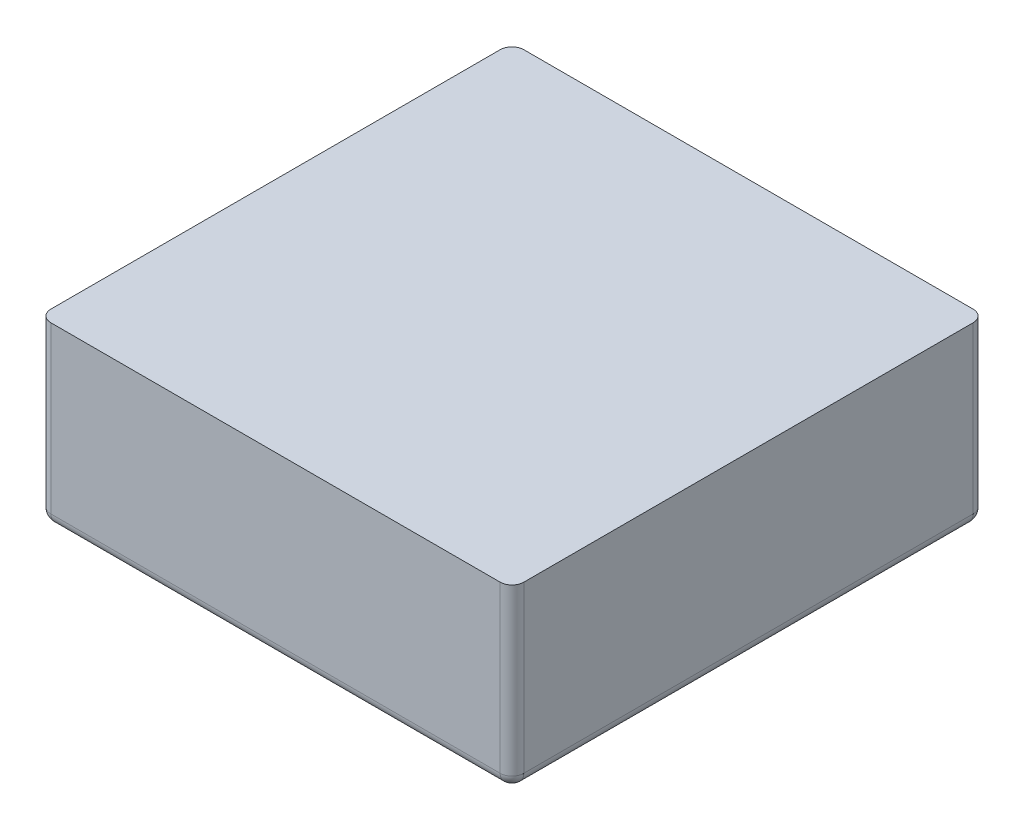
ISO-10303-21;
HEADER;
FILE_DESCRIPTION(('STEP AP214'),'2;1');
FILE_NAME('part.step','',(''),(''),'','','');
FILE_SCHEMA(('AUTOMOTIVE_DESIGN { 1 0 10303 214 1 1 1 1 }'));
ENDSEC;
DATA;
#1=APPLICATION_CONTEXT('core data for automotive mechanical design processes');
#2=APPLICATION_PROTOCOL_DEFINITION('international standard','automotive_design',2000,#1);
#3=PRODUCT_CONTEXT('',#1,'mechanical');
#4=PRODUCT('Part','Part','',(#3));
#5=PRODUCT_RELATED_PRODUCT_CATEGORY('part','',(#4));
#6=PRODUCT_DEFINITION_FORMATION('','',#4);
#7=PRODUCT_DEFINITION_CONTEXT('part definition',#1,'design');
#8=PRODUCT_DEFINITION('design','',#6,#7);
#9=PRODUCT_DEFINITION_SHAPE('','',#8);
#10=(LENGTH_UNIT() NAMED_UNIT(*) SI_UNIT(.MILLI.,.METRE.));
#11=(NAMED_UNIT(*) PLANE_ANGLE_UNIT() SI_UNIT($,.RADIAN.));
#12=(NAMED_UNIT(*) SI_UNIT($,.STERADIAN.) SOLID_ANGLE_UNIT());
#13=UNCERTAINTY_MEASURE_WITH_UNIT(LENGTH_MEASURE(1.E-05),#10,'distance_accuracy_value','');
#14=(GEOMETRIC_REPRESENTATION_CONTEXT(3) GLOBAL_UNCERTAINTY_ASSIGNED_CONTEXT((#13)) GLOBAL_UNIT_ASSIGNED_CONTEXT((#10,
#11,#12)) REPRESENTATION_CONTEXT('',''));
#15=CARTESIAN_POINT('',(0.,0.,0.));
#16=DIRECTION('',(0.,0.,1.));
#17=DIRECTION('',(1.,0.,0.));
#18=AXIS2_PLACEMENT_3D('',#15,#16,#17);
#19=CARTESIAN_POINT('',(-0.4,-0.8,-0.4));
#20=DIRECTION('',(0.,-1.,0.));
#21=DIRECTION('',(0.,0.,-1.));
#22=AXIS2_PLACEMENT_3D('',#19,#20,#21);
#23=PLANE('',#22);
#24=DIRECTION('',(0.,0.,1.));
#25=VECTOR('',#24,1.);
#26=CARTESIAN_POINT('',(0.38,-0.8,-0.4));
#27=LINE('',#26,#25);
#28=CARTESIAN_POINT('',(0.38,-0.8,0.38));
#29=VERTEX_POINT('',#28);
#30=CARTESIAN_POINT('',(0.38,-0.8,-0.38));
#31=VERTEX_POINT('',#30);
#32=EDGE_CURVE('E105',#29,#31,#27,.F.);
#33=ORIENTED_EDGE('',*,*,#32,.F.);
#34=DIRECTION('',(-1.,0.,0.));
#35=VECTOR('',#34,1.);
#36=CARTESIAN_POINT('',(-0.4,-0.8,0.38));
#37=LINE('',#36,#35);
#38=CARTESIAN_POINT('',(-0.38,-0.8,0.380000000000024));
#39=VERTEX_POINT('',#38);
#40=EDGE_CURVE('E100',#39,#29,#37,.F.);
#41=ORIENTED_EDGE('',*,*,#40,.F.);
#42=DIRECTION('',(0.,0.,-1.));
#43=VECTOR('',#42,1.);
#44=CARTESIAN_POINT('',(-0.38,-0.8,-0.4));
#45=LINE('',#44,#43);
#46=CARTESIAN_POINT('',(-0.38,-0.8,-0.38));
#47=VERTEX_POINT('',#46);
#48=EDGE_CURVE('E103',#47,#39,#45,.F.);
#49=ORIENTED_EDGE('',*,*,#48,.F.);
#50=DIRECTION('',(1.,0.,0.));
#51=VECTOR('',#50,1.);
#52=CARTESIAN_POINT('',(-0.4,-0.8,-0.38));
#53=LINE('',#52,#51);
#54=EDGE_CURVE('E167',#31,#47,#53,.F.);
#55=ORIENTED_EDGE('',*,*,#54,.F.);
#56=EDGE_LOOP('',(#33,#41,#49,#55));
#57=FACE_BOUND('',#56,.T.);
#58=ADVANCED_FACE('F16',(#57),#23,.T.);
#59=CARTESIAN_POINT('',(0.38,-0.78,0.38));
#60=DIRECTION('',(1.,0.,0.));
#61=DIRECTION('',(0.,1.,0.));
#62=AXIS2_PLACEMENT_3D('',#59,#60,#61);
#63=SPHERICAL_SURFACE('',#62,0.02);
#64=CARTESIAN_POINT('',(0.38,-0.78,0.38));
#65=DIRECTION('',(-1.,0.,0.));
#66=DIRECTION('',(0.,0.,1.));
#67=AXIS2_PLACEMENT_3D('',#64,#65,#66);
#68=CIRCLE('',#67,0.02);
#69=CARTESIAN_POINT('',(0.38,-0.78,0.4));
#70=VERTEX_POINT('',#69);
#71=EDGE_CURVE('E108',#29,#70,#68,.T.);
#72=ORIENTED_EDGE('',*,*,#71,.F.);
#73=CARTESIAN_POINT('',(0.38,-0.78,0.38));
#74=DIRECTION('',(0.,0.,1.));
#75=DIRECTION('',(1.,0.,0.));
#76=AXIS2_PLACEMENT_3D('',#73,#74,#75);
#77=CIRCLE('',#76,0.02);
#78=CARTESIAN_POINT('',(0.4,-0.78,0.38));
#79=VERTEX_POINT('',#78);
#80=EDGE_CURVE('E164',#79,#29,#77,.F.);
#81=ORIENTED_EDGE('',*,*,#80,.F.);
#82=CARTESIAN_POINT('',(0.38,-0.78,0.38));
#83=DIRECTION('',(0.,-1.,0.));
#84=DIRECTION('',(0.,0.,-1.));
#85=AXIS2_PLACEMENT_3D('',#82,#83,#84);
#86=CIRCLE('',#85,0.02);
#87=EDGE_CURVE('E230',#70,#79,#86,.F.);
#88=ORIENTED_EDGE('',*,*,#87,.F.);
#89=EDGE_LOOP('',(#72,#81,#88));
#90=FACE_BOUND('',#89,.T.);
#91=ADVANCED_FACE('F154',(#90),#63,.T.);
#92=CARTESIAN_POINT('',(-0.4,-0.78,0.38));
#93=DIRECTION('',(-1.,0.,0.));
#94=DIRECTION('',(0.,0.,1.));
#95=AXIS2_PLACEMENT_3D('',#92,#93,#94);
#96=CYLINDRICAL_SURFACE('',#95,0.02);
#97=ORIENTED_EDGE('',*,*,#71,.T.);
#98=DIRECTION('',(-1.,0.,0.));
#99=VECTOR('',#98,1.);
#100=CARTESIAN_POINT('',(0.4,-0.78,0.4));
#101=LINE('',#100,#99);
#102=CARTESIAN_POINT('',(-0.38,-0.78,0.4));
#103=VERTEX_POINT('',#102);
#104=EDGE_CURVE('E114',#70,#103,#101,.T.);
#105=ORIENTED_EDGE('',*,*,#104,.T.);
#106=CARTESIAN_POINT('',(-0.38,-0.78,0.38));
#107=DIRECTION('',(1.,0.,0.));
#108=DIRECTION('',(0.,1.,0.));
#109=AXIS2_PLACEMENT_3D('',#106,#107,#108);
#110=CIRCLE('',#109,0.0200000000000001);
#111=EDGE_CURVE('E111',#39,#103,#110,.F.);
#112=ORIENTED_EDGE('',*,*,#111,.F.);
#113=ORIENTED_EDGE('',*,*,#40,.T.);
#114=EDGE_LOOP('',(#97,#105,#112,#113));
#115=FACE_BOUND('',#114,.T.);
#116=ADVANCED_FACE('F112',(#115),#96,.T.);
#117=CARTESIAN_POINT('',(-0.38,-0.78,0.38));
#118=DIRECTION('',(1.,0.,0.));
#119=DIRECTION('',(0.,1.,0.));
#120=AXIS2_PLACEMENT_3D('',#117,#118,#119);
#121=SPHERICAL_SURFACE('',#120,0.02);
#122=CARTESIAN_POINT('',(-0.38,-0.78,0.38));
#123=DIRECTION('',(0.,-1.,0.));
#124=DIRECTION('',(0.,0.,-1.));
#125=AXIS2_PLACEMENT_3D('',#122,#123,#124);
#126=CIRCLE('',#125,0.02);
#127=CARTESIAN_POINT('',(-0.4,-0.78,0.38));
#128=VERTEX_POINT('',#127);
#129=EDGE_CURVE('E129',#128,#103,#126,.F.);
#130=ORIENTED_EDGE('',*,*,#129,.F.);
#131=CARTESIAN_POINT('',(-0.38,-0.78,0.38));
#132=DIRECTION('',(0.,0.,-1.));
#133=DIRECTION('',(-1.,0.,0.));
#134=AXIS2_PLACEMENT_3D('',#131,#132,#133);
#135=CIRCLE('',#134,0.02);
#136=EDGE_CURVE('E120',#39,#128,#135,.T.);
#137=ORIENTED_EDGE('',*,*,#136,.F.);
#138=ORIENTED_EDGE('',*,*,#111,.T.);
#139=EDGE_LOOP('',(#130,#137,#138));
#140=FACE_BOUND('',#139,.T.);
#141=ADVANCED_FACE('F128',(#140),#121,.T.);
#142=CARTESIAN_POINT('',(-0.38,-0.78,-0.4));
#143=DIRECTION('',(0.,0.,-1.));
#144=DIRECTION('',(-1.,0.,0.));
#145=AXIS2_PLACEMENT_3D('',#142,#143,#144);
#146=CYLINDRICAL_SURFACE('',#145,0.02);
#147=CARTESIAN_POINT('',(-0.38,-0.78,-0.38));
#148=DIRECTION('',(0.,0.,-1.));
#149=DIRECTION('',(1.,0.,0.));
#150=AXIS2_PLACEMENT_3D('',#147,#148,#149);
#151=CIRCLE('',#150,0.02);
#152=CARTESIAN_POINT('',(-0.4,-0.78,-0.38));
#153=VERTEX_POINT('',#152);
#154=EDGE_CURVE('E125',#47,#153,#151,.T.);
#155=ORIENTED_EDGE('',*,*,#154,.F.);
#156=ORIENTED_EDGE('',*,*,#48,.T.);
#157=ORIENTED_EDGE('',*,*,#136,.T.);
#158=DIRECTION('',(0.,0.,-1.));
#159=VECTOR('',#158,1.);
#160=CARTESIAN_POINT('',(-0.4,-0.78,0.4));
#161=LINE('',#160,#159);
#162=EDGE_CURVE('E222',#128,#153,#161,.T.);
#163=ORIENTED_EDGE('',*,*,#162,.T.);
#164=EDGE_LOOP('',(#155,#156,#157,#163));
#165=FACE_BOUND('',#164,.T.);
#166=ADVANCED_FACE('F123',(#165),#146,.T.);
#167=CARTESIAN_POINT('',(-0.38,-0.78,-0.38));
#168=DIRECTION('',(1.,0.,0.));
#169=DIRECTION('',(0.,1.,0.));
#170=AXIS2_PLACEMENT_3D('',#167,#168,#169);
#171=SPHERICAL_SURFACE('',#170,0.02);
#172=CARTESIAN_POINT('',(-0.38,-0.78,-0.38));
#173=DIRECTION('',(0.,-1.,0.));
#174=DIRECTION('',(0.,0.,-1.));
#175=AXIS2_PLACEMENT_3D('',#172,#173,#174);
#176=CIRCLE('',#175,0.02);
#177=CARTESIAN_POINT('',(-0.38,-0.78,-0.4));
#178=VERTEX_POINT('',#177);
#179=EDGE_CURVE('E217',#178,#153,#176,.F.);
#180=ORIENTED_EDGE('',*,*,#179,.F.);
#181=CARTESIAN_POINT('',(-0.38,-0.78,-0.38));
#182=DIRECTION('',(1.,0.,0.));
#183=DIRECTION('',(0.,0.,-1.));
#184=AXIS2_PLACEMENT_3D('',#181,#182,#183);
#185=CIRCLE('',#184,0.02);
#186=EDGE_CURVE('E170',#47,#178,#185,.T.);
#187=ORIENTED_EDGE('',*,*,#186,.F.);
#188=ORIENTED_EDGE('',*,*,#154,.T.);
#189=EDGE_LOOP('',(#180,#187,#188));
#190=FACE_BOUND('',#189,.T.);
#191=ADVANCED_FACE('F266',(#190),#171,.T.);
#192=CARTESIAN_POINT('',(-0.4,-0.78,-0.38));
#193=DIRECTION('',(1.,0.,0.));
#194=DIRECTION('',(0.,0.,-1.));
#195=AXIS2_PLACEMENT_3D('',#192,#193,#194);
#196=CYLINDRICAL_SURFACE('',#195,0.02);
#197=CARTESIAN_POINT('',(0.38,-0.78,-0.38));
#198=DIRECTION('',(1.,0.,0.));
#199=DIRECTION('',(0.,1.,0.));
#200=AXIS2_PLACEMENT_3D('',#197,#198,#199);
#201=CIRCLE('',#200,0.0200000000000001);
#202=CARTESIAN_POINT('',(0.38,-0.78,-0.4));
#203=VERTEX_POINT('',#202);
#204=EDGE_CURVE('E169',#31,#203,#201,.T.);
#205=ORIENTED_EDGE('',*,*,#204,.F.);
#206=ORIENTED_EDGE('',*,*,#54,.T.);
#207=ORIENTED_EDGE('',*,*,#186,.T.);
#208=DIRECTION('',(1.,0.,0.));
#209=VECTOR('',#208,1.);
#210=CARTESIAN_POINT('',(-0.4,-0.78,-0.4));
#211=LINE('',#210,#209);
#212=EDGE_CURVE('E212',#178,#203,#211,.T.);
#213=ORIENTED_EDGE('',*,*,#212,.T.);
#214=EDGE_LOOP('',(#205,#206,#207,#213));
#215=FACE_BOUND('',#214,.T.);
#216=ADVANCED_FACE('F262',(#215),#196,.T.);
#217=CARTESIAN_POINT('',(0.38,-0.78,-0.38));
#218=DIRECTION('',(1.,0.,0.));
#219=DIRECTION('',(0.,1.,0.));
#220=AXIS2_PLACEMENT_3D('',#217,#218,#219);
#221=SPHERICAL_SURFACE('',#220,0.02);
#222=ORIENTED_EDGE('',*,*,#204,.T.);
#223=CARTESIAN_POINT('',(0.38,-0.78,-0.38));
#224=DIRECTION('',(0.,-1.,0.));
#225=DIRECTION('',(0.,0.,-1.));
#226=AXIS2_PLACEMENT_3D('',#223,#224,#225);
#227=CIRCLE('',#226,0.02);
#228=CARTESIAN_POINT('',(0.4,-0.78,-0.38));
#229=VERTEX_POINT('',#228);
#230=EDGE_CURVE('E206',#229,#203,#227,.F.);
#231=ORIENTED_EDGE('',*,*,#230,.F.);
#232=CARTESIAN_POINT('',(0.38,-0.78,-0.38));
#233=DIRECTION('',(0.,0.,1.));
#234=DIRECTION('',(1.,0.,0.));
#235=AXIS2_PLACEMENT_3D('',#232,#233,#234);
#236=CIRCLE('',#235,0.02);
#237=EDGE_CURVE('E65',#31,#229,#236,.T.);
#238=ORIENTED_EDGE('',*,*,#237,.F.);
#239=EDGE_LOOP('',(#222,#231,#238));
#240=FACE_BOUND('',#239,.T.);
#241=ADVANCED_FACE('F257',(#240),#221,.T.);
#242=CARTESIAN_POINT('',(0.38,-0.78,-0.4));
#243=DIRECTION('',(0.,0.,1.));
#244=DIRECTION('',(1.,0.,0.));
#245=AXIS2_PLACEMENT_3D('',#242,#243,#244);
#246=CYLINDRICAL_SURFACE('',#245,0.02);
#247=ORIENTED_EDGE('',*,*,#237,.T.);
#248=DIRECTION('',(0.,0.,1.));
#249=VECTOR('',#248,1.);
#250=CARTESIAN_POINT('',(0.4,-0.78,-0.4));
#251=LINE('',#250,#249);
#252=EDGE_CURVE('E194',#229,#79,#251,.T.);
#253=ORIENTED_EDGE('',*,*,#252,.T.);
#254=ORIENTED_EDGE('',*,*,#80,.T.);
#255=ORIENTED_EDGE('',*,*,#32,.T.);
#256=EDGE_LOOP('',(#247,#253,#254,#255));
#257=FACE_BOUND('',#256,.T.);
#258=ADVANCED_FACE('F261',(#257),#246,.T.);
#259=CARTESIAN_POINT('',(0.38,-0.8,0.38));
#260=DIRECTION('',(0.,-1.,0.));
#261=DIRECTION('',(0.,0.,-1.));
#262=AXIS2_PLACEMENT_3D('',#259,#260,#261);
#263=CYLINDRICAL_SURFACE('',#262,0.02);
#264=ORIENTED_EDGE('',*,*,#87,.T.);
#265=DIRECTION('',(0.,1.,0.));
#266=VECTOR('',#265,1.);
#267=CARTESIAN_POINT('',(0.4,-0.8,0.38));
#268=LINE('',#267,#266);
#269=CARTESIAN_POINT('',(0.4,-0.5,0.38));
#270=VERTEX_POINT('',#269);
#271=EDGE_CURVE('E198',#79,#270,#268,.T.);
#272=ORIENTED_EDGE('',*,*,#271,.T.);
#273=CARTESIAN_POINT('',(0.38,-0.5,0.38));
#274=DIRECTION('',(0.,-1.,0.));
#275=DIRECTION('',(0.,0.,-1.));
#276=AXIS2_PLACEMENT_3D('',#273,#274,#275);
#277=CIRCLE('',#276,0.02);
#278=CARTESIAN_POINT('',(0.38,-0.5,0.4));
#279=VERTEX_POINT('',#278);
#280=EDGE_CURVE('E19',#270,#279,#277,.T.);
#281=ORIENTED_EDGE('',*,*,#280,.T.);
#282=DIRECTION('',(0.,1.,0.));
#283=VECTOR('',#282,1.);
#284=CARTESIAN_POINT('',(0.38,-0.8,0.4));
#285=LINE('',#284,#283);
#286=EDGE_CURVE('E143',#279,#70,#285,.F.);
#287=ORIENTED_EDGE('',*,*,#286,.T.);
#288=EDGE_LOOP('',(#264,#272,#281,#287));
#289=FACE_BOUND('',#288,.T.);
#290=ADVANCED_FACE('F373',(#289),#263,.T.);
#291=CARTESIAN_POINT('',(0.4,-0.8,0.4));
#292=DIRECTION('',(0.,0.,-1.));
#293=DIRECTION('',(-1.,0.,0.));
#294=AXIS2_PLACEMENT_3D('',#291,#292,#293);
#295=PLANE('',#294);
#296=ORIENTED_EDGE('',*,*,#286,.F.);
#297=DIRECTION('',(1.,0.,0.));
#298=VECTOR('',#297,1.);
#299=CARTESIAN_POINT('',(-0.4,-0.5,0.4));
#300=LINE('',#299,#298);
#301=CARTESIAN_POINT('',(-0.38,-0.5,0.4));
#302=VERTEX_POINT('',#301);
#303=EDGE_CURVE('E185',#279,#302,#300,.F.);
#304=ORIENTED_EDGE('',*,*,#303,.T.);
#305=DIRECTION('',(0.,-1.,0.));
#306=VECTOR('',#305,1.);
#307=CARTESIAN_POINT('',(-0.38,-0.8,0.4));
#308=LINE('',#307,#306);
#309=EDGE_CURVE('E139',#103,#302,#308,.F.);
#310=ORIENTED_EDGE('',*,*,#309,.F.);
#311=ORIENTED_EDGE('',*,*,#104,.F.);
#312=EDGE_LOOP('',(#296,#304,#310,#311));
#313=FACE_BOUND('',#312,.T.);
#314=ADVANCED_FACE('F364',(#313),#295,.F.);
#315=CARTESIAN_POINT('',(-0.38,-0.8,0.38));
#316=DIRECTION('',(0.,-1.,0.));
#317=DIRECTION('',(0.,0.,-1.));
#318=AXIS2_PLACEMENT_3D('',#315,#316,#317);
#319=CYLINDRICAL_SURFACE('',#318,0.02);
#320=CARTESIAN_POINT('',(-0.38,-0.5,0.38));
#321=DIRECTION('',(0.,-1.,0.));
#322=DIRECTION('',(0.,0.,-1.));
#323=AXIS2_PLACEMENT_3D('',#320,#321,#322);
#324=CIRCLE('',#323,0.02);
#325=CARTESIAN_POINT('',(-0.4,-0.5,0.38));
#326=VERTEX_POINT('',#325);
#327=EDGE_CURVE('E183',#302,#326,#324,.T.);
#328=ORIENTED_EDGE('',*,*,#327,.T.);
#329=DIRECTION('',(0.,1.,0.));
#330=VECTOR('',#329,1.);
#331=CARTESIAN_POINT('',(-0.4,-0.8,0.38));
#332=LINE('',#331,#330);
#333=EDGE_CURVE('E220',#326,#128,#332,.F.);
#334=ORIENTED_EDGE('',*,*,#333,.T.);
#335=ORIENTED_EDGE('',*,*,#129,.T.);
#336=ORIENTED_EDGE('',*,*,#309,.T.);
#337=EDGE_LOOP('',(#328,#334,#335,#336));
#338=FACE_BOUND('',#337,.T.);
#339=ADVANCED_FACE('F355',(#338),#319,.T.);
#340=CARTESIAN_POINT('',(-0.4,-0.8,0.4));
#341=DIRECTION('',(1.,0.,0.));
#342=DIRECTION('',(0.,0.,-1.));
#343=AXIS2_PLACEMENT_3D('',#340,#341,#342);
#344=PLANE('',#343);
#345=DIRECTION('',(0.,-1.,0.));
#346=VECTOR('',#345,1.);
#347=CARTESIAN_POINT('',(-0.4,-0.8,-0.38));
#348=LINE('',#347,#346);
#349=CARTESIAN_POINT('',(-0.4,-0.5,-0.38));
#350=VERTEX_POINT('',#349);
#351=EDGE_CURVE('E213',#153,#350,#348,.F.);
#352=ORIENTED_EDGE('',*,*,#351,.F.);
#353=ORIENTED_EDGE('',*,*,#162,.F.);
#354=ORIENTED_EDGE('',*,*,#333,.F.);
#355=DIRECTION('',(0.,0.,-1.));
#356=VECTOR('',#355,1.);
#357=CARTESIAN_POINT('',(-0.4,-0.5,-0.4));
#358=LINE('',#357,#356);
#359=EDGE_CURVE('E182',#326,#350,#358,.T.);
#360=ORIENTED_EDGE('',*,*,#359,.T.);
#361=EDGE_LOOP('',(#352,#353,#354,#360));
#362=FACE_BOUND('',#361,.T.);
#363=ADVANCED_FACE('F287',(#362),#344,.F.);
#364=CARTESIAN_POINT('',(-0.38,-0.8,-0.38));
#365=DIRECTION('',(0.,-1.,0.));
#366=DIRECTION('',(0.,0.,-1.));
#367=AXIS2_PLACEMENT_3D('',#364,#365,#366);
#368=CYLINDRICAL_SURFACE('',#367,0.02);
#369=ORIENTED_EDGE('',*,*,#179,.T.);
#370=ORIENTED_EDGE('',*,*,#351,.T.);
#371=CARTESIAN_POINT('',(-0.38,-0.5,-0.38));
#372=DIRECTION('',(0.,-1.,0.));
#373=DIRECTION('',(0.,0.,-1.));
#374=AXIS2_PLACEMENT_3D('',#371,#372,#373);
#375=CIRCLE('',#374,0.02);
#376=CARTESIAN_POINT('',(-0.38,-0.5,-0.4));
#377=VERTEX_POINT('',#376);
#378=EDGE_CURVE('E180',#350,#377,#375,.T.);
#379=ORIENTED_EDGE('',*,*,#378,.T.);
#380=DIRECTION('',(0.,-1.,0.));
#381=VECTOR('',#380,1.);
#382=CARTESIAN_POINT('',(-0.38,-0.8,-0.4));
#383=LINE('',#382,#381);
#384=EDGE_CURVE('E209',#377,#178,#383,.T.);
#385=ORIENTED_EDGE('',*,*,#384,.T.);
#386=EDGE_LOOP('',(#369,#370,#379,#385));
#387=FACE_BOUND('',#386,.T.);
#388=ADVANCED_FACE('F291',(#387),#368,.T.);
#389=CARTESIAN_POINT('',(-0.4,-0.8,-0.4));
#390=DIRECTION('',(0.,0.,1.));
#391=DIRECTION('',(0.,-1.,0.));
#392=AXIS2_PLACEMENT_3D('',#389,#390,#391);
#393=PLANE('',#392);
#394=DIRECTION('',(0.,-1.,0.));
#395=VECTOR('',#394,1.);
#396=CARTESIAN_POINT('',(0.38,-0.8,-0.4));
#397=LINE('',#396,#395);
#398=CARTESIAN_POINT('',(0.38,-0.5,-0.4));
#399=VERTEX_POINT('',#398);
#400=EDGE_CURVE('E202',#203,#399,#397,.F.);
#401=ORIENTED_EDGE('',*,*,#400,.F.);
#402=ORIENTED_EDGE('',*,*,#212,.F.);
#403=ORIENTED_EDGE('',*,*,#384,.F.);
#404=DIRECTION('',(1.,0.,0.));
#405=VECTOR('',#404,1.);
#406=CARTESIAN_POINT('',(-0.4,-0.5,-0.4));
#407=LINE('',#406,#405);
#408=EDGE_CURVE('E179',#377,#399,#407,.T.);
#409=ORIENTED_EDGE('',*,*,#408,.T.);
#410=EDGE_LOOP('',(#401,#402,#403,#409));
#411=FACE_BOUND('',#410,.T.);
#412=ADVANCED_FACE('F298',(#411),#393,.F.);
#413=CARTESIAN_POINT('',(0.38,-0.8,-0.38));
#414=DIRECTION('',(0.,-1.,0.));
#415=DIRECTION('',(0.,0.,-1.));
#416=AXIS2_PLACEMENT_3D('',#413,#414,#415);
#417=CYLINDRICAL_SURFACE('',#416,0.02);
#418=CARTESIAN_POINT('',(0.38,-0.5,-0.38));
#419=DIRECTION('',(0.,-1.,0.));
#420=DIRECTION('',(0.,0.,-1.));
#421=AXIS2_PLACEMENT_3D('',#418,#419,#420);
#422=CIRCLE('',#421,0.02);
#423=CARTESIAN_POINT('',(0.4,-0.5,-0.38));
#424=VERTEX_POINT('',#423);
#425=EDGE_CURVE('E25',#399,#424,#422,.T.);
#426=ORIENTED_EDGE('',*,*,#425,.T.);
#427=DIRECTION('',(0.,1.,0.));
#428=VECTOR('',#427,1.);
#429=CARTESIAN_POINT('',(0.4,-0.8,-0.38));
#430=LINE('',#429,#428);
#431=EDGE_CURVE('E33',#424,#229,#430,.F.);
#432=ORIENTED_EDGE('',*,*,#431,.T.);
#433=ORIENTED_EDGE('',*,*,#230,.T.);
#434=ORIENTED_EDGE('',*,*,#400,.T.);
#435=EDGE_LOOP('',(#426,#432,#433,#434));
#436=FACE_BOUND('',#435,.T.);
#437=ADVANCED_FACE('F305',(#436),#417,.T.);
#438=CARTESIAN_POINT('',(0.4,-0.8,-0.4));
#439=DIRECTION('',(-1.,0.,0.));
#440=DIRECTION('',(0.,0.,1.));
#441=AXIS2_PLACEMENT_3D('',#438,#439,#440);
#442=PLANE('',#441);
#443=ORIENTED_EDGE('',*,*,#431,.F.);
#444=DIRECTION('',(0.,0.,-1.));
#445=VECTOR('',#444,1.);
#446=CARTESIAN_POINT('',(0.4,-0.5,-0.4));
#447=LINE('',#446,#445);
#448=EDGE_CURVE('E11',#424,#270,#447,.F.);
#449=ORIENTED_EDGE('',*,*,#448,.T.);
#450=ORIENTED_EDGE('',*,*,#271,.F.);
#451=ORIENTED_EDGE('',*,*,#252,.F.);
#452=EDGE_LOOP('',(#443,#449,#450,#451));
#453=FACE_BOUND('',#452,.T.);
#454=ADVANCED_FACE('F303',(#453),#442,.F.);
#455=CARTESIAN_POINT('',(-0.4,-0.5,-0.4));
#456=DIRECTION('',(0.,-1.,0.));
#457=DIRECTION('',(0.,0.,-1.));
#458=AXIS2_PLACEMENT_3D('',#455,#456,#457);
#459=PLANE('',#458);
#460=ORIENTED_EDGE('',*,*,#425,.F.);
#461=ORIENTED_EDGE('',*,*,#408,.F.);
#462=ORIENTED_EDGE('',*,*,#378,.F.);
#463=ORIENTED_EDGE('',*,*,#359,.F.);
#464=ORIENTED_EDGE('',*,*,#327,.F.);
#465=ORIENTED_EDGE('',*,*,#303,.F.);
#466=ORIENTED_EDGE('',*,*,#280,.F.);
#467=ORIENTED_EDGE('',*,*,#448,.F.);
#468=EDGE_LOOP('',(#460,#461,#462,#463,#464,#465,#466,#467));
#469=FACE_BOUND('',#468,.T.);
#470=ADVANCED_FACE('F294',(#469),#459,.F.);
#471=CLOSED_SHELL('',(#58,#91,#116,#141,#166,#191,#216,#241,#258,#290,#314,#339,#363,#388,#412,
#437,#454,#470));
#472=MANIFOLD_SOLID_BREP('B1',#471);
#473=ADVANCED_BREP_SHAPE_REPRESENTATION('',(#18,#472),#14);
#474=SHAPE_DEFINITION_REPRESENTATION(#9,#473);
ENDSEC;
END-ISO-10303-21;
